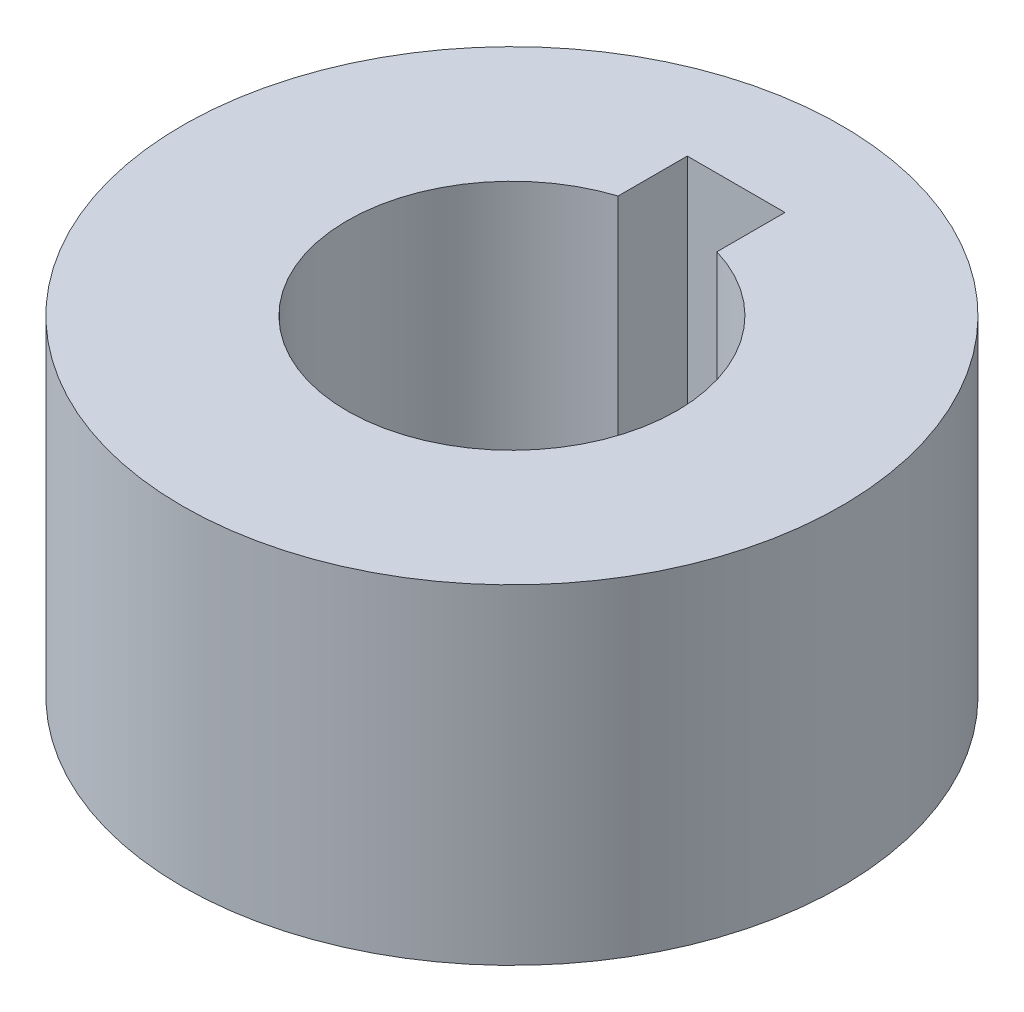
ISO-10303-21;
HEADER;
FILE_DESCRIPTION(('STEP AP214'),'2;1');
FILE_NAME('part.step','',(''),(''),'','','');
FILE_SCHEMA(('AUTOMOTIVE_DESIGN { 1 0 10303 214 1 1 1 1 }'));
ENDSEC;
DATA;
#1=APPLICATION_CONTEXT('core data for automotive mechanical design processes');
#2=APPLICATION_PROTOCOL_DEFINITION('international standard','automotive_design',2000,#1);
#3=PRODUCT_CONTEXT('',#1,'mechanical');
#4=PRODUCT('Part','Part','',(#3));
#5=PRODUCT_RELATED_PRODUCT_CATEGORY('part','',(#4));
#6=PRODUCT_DEFINITION_FORMATION('','',#4);
#7=PRODUCT_DEFINITION_CONTEXT('part definition',#1,'design');
#8=PRODUCT_DEFINITION('design','',#6,#7);
#9=PRODUCT_DEFINITION_SHAPE('','',#8);
#10=(LENGTH_UNIT() NAMED_UNIT(*) SI_UNIT(.MILLI.,.METRE.));
#11=(NAMED_UNIT(*) PLANE_ANGLE_UNIT() SI_UNIT($,.RADIAN.));
#12=(NAMED_UNIT(*) SI_UNIT($,.STERADIAN.) SOLID_ANGLE_UNIT());
#13=UNCERTAINTY_MEASURE_WITH_UNIT(LENGTH_MEASURE(1.E-05),#10,'distance_accuracy_value','');
#14=(GEOMETRIC_REPRESENTATION_CONTEXT(3) GLOBAL_UNCERTAINTY_ASSIGNED_CONTEXT((#13)) GLOBAL_UNIT_ASSIGNED_CONTEXT((#10,
#11,#12)) REPRESENTATION_CONTEXT('',''));
#15=CARTESIAN_POINT('',(0.,0.,0.));
#16=DIRECTION('',(0.,0.,1.));
#17=DIRECTION('',(1.,0.,0.));
#18=AXIS2_PLACEMENT_3D('',#15,#16,#17);
#19=CARTESIAN_POINT('',(0.,10.,0.));
#20=DIRECTION('',(0.,-1.,0.));
#21=DIRECTION('',(0.,0.,-1.));
#22=AXIS2_PLACEMENT_3D('',#19,#20,#21);
#23=CYLINDRICAL_SURFACE('',#22,5.);
#24=CARTESIAN_POINT('',(0.,0.,0.));
#25=DIRECTION('',(0.,1.,0.));
#26=DIRECTION('',(0.,0.,1.));
#27=AXIS2_PLACEMENT_3D('',#24,#25,#26);
#28=CIRCLE('',#27,5.);
#29=CARTESIAN_POINT('',(-1.53613260342943,0.,-4.75818207140933));
#30=VERTEX_POINT('',#29);
#31=CARTESIAN_POINT('',(1.42820444518432,0.,-4.79168363550389));
#32=VERTEX_POINT('',#31);
#33=EDGE_CURVE('E99',#30,#32,#28,.T.);
#34=ORIENTED_EDGE('',*,*,#33,.F.);
#35=DIRECTION('',(0.,-1.,0.));
#36=VECTOR('',#35,1.);
#37=CARTESIAN_POINT('',(-1.53613260342943,10.,-4.75818207140933));
#38=LINE('',#37,#36);
#39=CARTESIAN_POINT('',(-1.53613260342943,10.,-4.75818207140933));
#40=VERTEX_POINT('',#39);
#41=EDGE_CURVE('E11',#40,#30,#38,.T.);
#42=ORIENTED_EDGE('',*,*,#41,.F.);
#43=CARTESIAN_POINT('',(0.,10.,0.));
#44=DIRECTION('',(0.,1.,0.));
#45=DIRECTION('',(0.,0.,1.));
#46=AXIS2_PLACEMENT_3D('',#43,#44,#45);
#47=CIRCLE('',#46,5.);
#48=CARTESIAN_POINT('',(1.42820444518432,10.,-4.79168363550389));
#49=VERTEX_POINT('',#48);
#50=EDGE_CURVE('E84',#40,#49,#47,.T.);
#51=ORIENTED_EDGE('',*,*,#50,.T.);
#52=DIRECTION('',(0.,-1.,0.));
#53=VECTOR('',#52,1.);
#54=CARTESIAN_POINT('',(1.42820444518432,10.,-4.79168363550389));
#55=LINE('',#54,#53);
#56=EDGE_CURVE('E72',#49,#32,#55,.T.);
#57=ORIENTED_EDGE('',*,*,#56,.T.);
#58=EDGE_LOOP('',(#34,#42,#51,#57));
#59=FACE_BOUND('',#58,.T.);
#60=ADVANCED_FACE('F33',(#59),#23,.F.);
#61=CARTESIAN_POINT('',(-1.53613260342943,10.,0.));
#62=DIRECTION('',(-1.,0.,0.));
#63=DIRECTION('',(0.,0.,1.));
#64=AXIS2_PLACEMENT_3D('',#61,#62,#63);
#65=PLANE('',#64);
#66=DIRECTION('',(0.,0.,-1.));
#67=VECTOR('',#66,1.);
#68=CARTESIAN_POINT('',(-1.53613260342943,0.,0.));
#69=LINE('',#68,#67);
#70=CARTESIAN_POINT('',(-1.53613260342943,0.,-6.85676643688363));
#71=VERTEX_POINT('',#70);
#72=EDGE_CURVE('E89',#30,#71,#69,.T.);
#73=ORIENTED_EDGE('',*,*,#72,.T.);
#74=DIRECTION('',(0.,-1.,0.));
#75=VECTOR('',#74,1.);
#76=CARTESIAN_POINT('',(-1.53613260342943,10.,-6.85676643688363));
#77=LINE('',#76,#75);
#78=CARTESIAN_POINT('',(-1.53613260342943,10.,-6.85676643688363));
#79=VERTEX_POINT('',#78);
#80=EDGE_CURVE('E41',#79,#71,#77,.T.);
#81=ORIENTED_EDGE('',*,*,#80,.F.);
#82=DIRECTION('',(0.,0.,-1.));
#83=VECTOR('',#82,1.);
#84=CARTESIAN_POINT('',(-1.53613260342943,10.,0.));
#85=LINE('',#84,#83);
#86=EDGE_CURVE('E78',#40,#79,#85,.T.);
#87=ORIENTED_EDGE('',*,*,#86,.F.);
#88=ORIENTED_EDGE('',*,*,#41,.T.);
#89=EDGE_LOOP('',(#73,#81,#87,#88));
#90=FACE_BOUND('',#89,.T.);
#91=ADVANCED_FACE('F87',(#90),#65,.F.);
#92=CARTESIAN_POINT('',(0.,10.,-6.85676643688363));
#93=DIRECTION('',(0.,0.,-1.));
#94=DIRECTION('',(-1.,0.,0.));
#95=AXIS2_PLACEMENT_3D('',#92,#93,#94);
#96=PLANE('',#95);
#97=DIRECTION('',(1.,0.,0.));
#98=VECTOR('',#97,1.);
#99=CARTESIAN_POINT('',(0.,0.,-6.85676643688363));
#100=LINE('',#99,#98);
#101=CARTESIAN_POINT('',(1.42820444518432,0.,-6.85676643688363));
#102=VERTEX_POINT('',#101);
#103=EDGE_CURVE('E65',#71,#102,#100,.T.);
#104=ORIENTED_EDGE('',*,*,#103,.T.);
#105=DIRECTION('',(0.,-1.,0.));
#106=VECTOR('',#105,1.);
#107=CARTESIAN_POINT('',(1.42820444518432,10.,-6.85676643688363));
#108=LINE('',#107,#106);
#109=CARTESIAN_POINT('',(1.42820444518432,10.,-6.85676643688363));
#110=VERTEX_POINT('',#109);
#111=EDGE_CURVE('E90',#110,#102,#108,.T.);
#112=ORIENTED_EDGE('',*,*,#111,.F.);
#113=DIRECTION('',(1.,0.,0.));
#114=VECTOR('',#113,1.);
#115=CARTESIAN_POINT('',(0.,10.,-6.85676643688363));
#116=LINE('',#115,#114);
#117=EDGE_CURVE('E83',#79,#110,#116,.T.);
#118=ORIENTED_EDGE('',*,*,#117,.F.);
#119=ORIENTED_EDGE('',*,*,#80,.T.);
#120=EDGE_LOOP('',(#104,#112,#118,#119));
#121=FACE_BOUND('',#120,.T.);
#122=ADVANCED_FACE('F91',(#121),#96,.F.);
#123=CARTESIAN_POINT('',(1.42820444518432,10.,0.));
#124=DIRECTION('',(1.,0.,0.));
#125=DIRECTION('',(0.,0.,-1.));
#126=AXIS2_PLACEMENT_3D('',#123,#124,#125);
#127=PLANE('',#126);
#128=DIRECTION('',(0.,0.,1.));
#129=VECTOR('',#128,1.);
#130=CARTESIAN_POINT('',(1.42820444518432,0.,0.));
#131=LINE('',#130,#129);
#132=EDGE_CURVE('E104',#102,#32,#131,.T.);
#133=ORIENTED_EDGE('',*,*,#132,.T.);
#134=ORIENTED_EDGE('',*,*,#56,.F.);
#135=DIRECTION('',(0.,0.,1.));
#136=VECTOR('',#135,1.);
#137=CARTESIAN_POINT('',(1.42820444518432,10.,0.));
#138=LINE('',#137,#136);
#139=EDGE_CURVE('E49',#110,#49,#138,.T.);
#140=ORIENTED_EDGE('',*,*,#139,.F.);
#141=ORIENTED_EDGE('',*,*,#111,.T.);
#142=EDGE_LOOP('',(#133,#134,#140,#141));
#143=FACE_BOUND('',#142,.T.);
#144=ADVANCED_FACE('F112',(#143),#127,.F.);
#145=CARTESIAN_POINT('',(0.,10.,0.));
#146=DIRECTION('',(0.,-1.,0.));
#147=DIRECTION('',(0.,0.,-1.));
#148=AXIS2_PLACEMENT_3D('',#145,#146,#147);
#149=CYLINDRICAL_SURFACE('',#148,10.);
#150=CARTESIAN_POINT('',(0.,10.,0.));
#151=DIRECTION('',(0.,1.,0.));
#152=DIRECTION('',(0.,0.,1.));
#153=AXIS2_PLACEMENT_3D('',#150,#151,#152);
#154=CIRCLE('',#153,10.);
#155=CARTESIAN_POINT('',(0.,10.,10.));
#156=VERTEX_POINT('',#155);
#157=EDGE_CURVE('E93',#156,#156,#154,.T.);
#158=ORIENTED_EDGE('',*,*,#157,.F.);
#159=EDGE_LOOP('',(#158));
#160=FACE_BOUND('',#159,.T.);
#161=CARTESIAN_POINT('',(0.,0.,0.));
#162=DIRECTION('',(0.,1.,0.));
#163=DIRECTION('',(0.,0.,1.));
#164=AXIS2_PLACEMENT_3D('',#161,#162,#163);
#165=CIRCLE('',#164,10.);
#166=CARTESIAN_POINT('',(0.,0.,10.));
#167=VERTEX_POINT('',#166);
#168=EDGE_CURVE('E106',#167,#167,#165,.T.);
#169=ORIENTED_EDGE('',*,*,#168,.T.);
#170=EDGE_LOOP('',(#169));
#171=FACE_BOUND('',#170,.T.);
#172=ADVANCED_FACE('F127',(#160,#171),#149,.T.);
#173=CARTESIAN_POINT('',(0.,10.,0.));
#174=DIRECTION('',(0.,1.,0.));
#175=DIRECTION('',(0.,0.,1.));
#176=AXIS2_PLACEMENT_3D('',#173,#174,#175);
#177=PLANE('',#176);
#178=ORIENTED_EDGE('',*,*,#50,.F.);
#179=ORIENTED_EDGE('',*,*,#86,.T.);
#180=ORIENTED_EDGE('',*,*,#117,.T.);
#181=ORIENTED_EDGE('',*,*,#139,.T.);
#182=EDGE_LOOP('',(#178,#179,#180,#181));
#183=FACE_BOUND('',#182,.T.);
#184=ORIENTED_EDGE('',*,*,#157,.T.);
#185=EDGE_LOOP('',(#184));
#186=FACE_BOUND('',#185,.T.);
#187=ADVANCED_FACE('F80',(#183,#186),#177,.T.);
#188=CARTESIAN_POINT('',(0.,0.,0.));
#189=DIRECTION('',(0.,1.,0.));
#190=DIRECTION('',(0.,0.,1.));
#191=AXIS2_PLACEMENT_3D('',#188,#189,#190);
#192=PLANE('',#191);
#193=ORIENTED_EDGE('',*,*,#33,.T.);
#194=ORIENTED_EDGE('',*,*,#132,.F.);
#195=ORIENTED_EDGE('',*,*,#103,.F.);
#196=ORIENTED_EDGE('',*,*,#72,.F.);
#197=EDGE_LOOP('',(#193,#194,#195,#196));
#198=FACE_BOUND('',#197,.T.);
#199=ORIENTED_EDGE('',*,*,#168,.F.);
#200=EDGE_LOOP('',(#199));
#201=FACE_BOUND('',#200,.T.);
#202=ADVANCED_FACE('F114',(#198,#201),#192,.F.);
#203=CLOSED_SHELL('',(#60,#91,#122,#144,#172,#187,#202));
#204=MANIFOLD_SOLID_BREP('B2',#203);
#205=ADVANCED_BREP_SHAPE_REPRESENTATION('',(#18,#204),#14);
#206=SHAPE_DEFINITION_REPRESENTATION(#9,#205);
ENDSEC;
END-ISO-10303-21;
